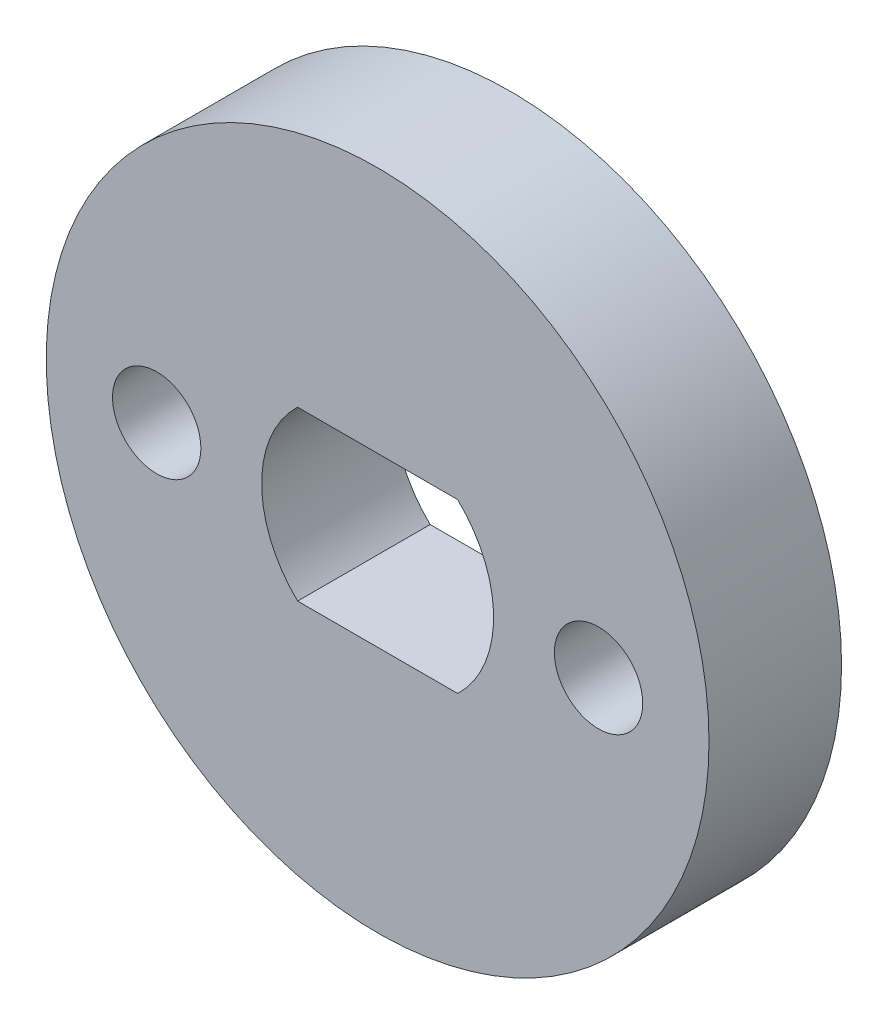
ISO-10303-21;
HEADER;
FILE_DESCRIPTION(('STEP AP214'),'2;1');
FILE_NAME('part.step','',(''),(''),'','','');
FILE_SCHEMA(('AUTOMOTIVE_DESIGN { 1 0 10303 214 1 1 1 1 }'));
ENDSEC;
DATA;
#1=APPLICATION_CONTEXT('core data for automotive mechanical design processes');
#2=APPLICATION_PROTOCOL_DEFINITION('international standard','automotive_design',2000,#1);
#3=PRODUCT_CONTEXT('',#1,'mechanical');
#4=PRODUCT('Part','Part','',(#3));
#5=PRODUCT_RELATED_PRODUCT_CATEGORY('part','',(#4));
#6=PRODUCT_DEFINITION_FORMATION('','',#4);
#7=PRODUCT_DEFINITION_CONTEXT('part definition',#1,'design');
#8=PRODUCT_DEFINITION('design','',#6,#7);
#9=PRODUCT_DEFINITION_SHAPE('','',#8);
#10=(LENGTH_UNIT() NAMED_UNIT(*) SI_UNIT(.MILLI.,.METRE.));
#11=(NAMED_UNIT(*) PLANE_ANGLE_UNIT() SI_UNIT($,.RADIAN.));
#12=(NAMED_UNIT(*) SI_UNIT($,.STERADIAN.) SOLID_ANGLE_UNIT());
#13=UNCERTAINTY_MEASURE_WITH_UNIT(LENGTH_MEASURE(1.E-05),#10,'distance_accuracy_value','');
#14=(GEOMETRIC_REPRESENTATION_CONTEXT(3) GLOBAL_UNCERTAINTY_ASSIGNED_CONTEXT((#13)) GLOBAL_UNIT_ASSIGNED_CONTEXT((#10,
#11,#12)) REPRESENTATION_CONTEXT('',''));
#15=CARTESIAN_POINT('',(0.,0.,0.));
#16=DIRECTION('',(0.,0.,1.));
#17=DIRECTION('',(1.,0.,0.));
#18=AXIS2_PLACEMENT_3D('',#15,#16,#17);
#19=CARTESIAN_POINT('',(0.,0.,3.));
#20=DIRECTION('',(0.,0.,1.));
#21=DIRECTION('',(1.,0.,0.));
#22=AXIS2_PLACEMENT_3D('',#19,#20,#21);
#23=PLANE('',#22);
#24=CARTESIAN_POINT('',(5.,0.,3.));
#25=DIRECTION('',(0.,0.,1.));
#26=DIRECTION('',(1.,0.,0.));
#27=AXIS2_PLACEMENT_3D('',#24,#25,#26);
#28=CIRCLE('',#27,0.999999999999998);
#29=CARTESIAN_POINT('',(6.,0.,3.));
#30=VERTEX_POINT('',#29);
#31=EDGE_CURVE('E155',#30,#30,#28,.T.);
#32=ORIENTED_EDGE('',*,*,#31,.F.);
#33=EDGE_LOOP('',(#32));
#34=FACE_BOUND('',#33,.T.);
#35=CARTESIAN_POINT('',(-5.,0.,3.));
#36=DIRECTION('',(0.,0.,1.));
#37=DIRECTION('',(1.,0.,0.));
#38=AXIS2_PLACEMENT_3D('',#35,#36,#37);
#39=CIRCLE('',#38,0.999999999999998);
#40=CARTESIAN_POINT('',(-4.,0.,3.));
#41=VERTEX_POINT('',#40);
#42=EDGE_CURVE('E102',#41,#41,#39,.T.);
#43=ORIENTED_EDGE('',*,*,#42,.F.);
#44=EDGE_LOOP('',(#43));
#45=FACE_BOUND('',#44,.T.);
#46=CARTESIAN_POINT('',(0.,0.,3.));
#47=DIRECTION('',(0.,0.,1.));
#48=DIRECTION('',(1.,0.,0.));
#49=AXIS2_PLACEMENT_3D('',#46,#47,#48);
#50=CIRCLE('',#49,7.5);
#51=CARTESIAN_POINT('',(7.5,0.,3.));
#52=VERTEX_POINT('',#51);
#53=EDGE_CURVE('E11',#52,#52,#50,.T.);
#54=ORIENTED_EDGE('',*,*,#53,.T.);
#55=EDGE_LOOP('',(#54));
#56=FACE_BOUND('',#55,.T.);
#57=CARTESIAN_POINT('',(0.,0.,3.));
#58=DIRECTION('',(0.,0.,-1.));
#59=DIRECTION('',(-1.,0.,0.));
#60=AXIS2_PLACEMENT_3D('',#57,#58,#59);
#61=CIRCLE('',#60,2.625);
#62=CARTESIAN_POINT('',(1.811249568668,1.9,3.));
#63=VERTEX_POINT('',#62);
#64=CARTESIAN_POINT('',(1.811249568668,-1.9,3.));
#65=VERTEX_POINT('',#64);
#66=EDGE_CURVE('E96',#63,#65,#61,.T.);
#67=ORIENTED_EDGE('',*,*,#66,.T.);
#68=DIRECTION('',(1.,0.,0.));
#69=VECTOR('',#68,1.);
#70=CARTESIAN_POINT('',(-1.811249568668,-1.9,3.));
#71=LINE('',#70,#69);
#72=CARTESIAN_POINT('',(-1.811249568668,-1.9,3.));
#73=VERTEX_POINT('',#72);
#74=EDGE_CURVE('E89',#73,#65,#71,.T.);
#75=ORIENTED_EDGE('',*,*,#74,.F.);
#76=CARTESIAN_POINT('',(0.,0.,3.));
#77=DIRECTION('',(0.,0.,1.));
#78=DIRECTION('',(1.,0.,0.));
#79=AXIS2_PLACEMENT_3D('',#76,#77,#78);
#80=CIRCLE('',#79,2.625);
#81=CARTESIAN_POINT('',(-1.811249568668,1.9,3.));
#82=VERTEX_POINT('',#81);
#83=EDGE_CURVE('E106',#82,#73,#80,.T.);
#84=ORIENTED_EDGE('',*,*,#83,.F.);
#85=DIRECTION('',(-1.,0.,0.));
#86=VECTOR('',#85,1.);
#87=CARTESIAN_POINT('',(-1.811249568668,1.9,3.));
#88=LINE('',#87,#86);
#89=EDGE_CURVE('E84',#63,#82,#88,.T.);
#90=ORIENTED_EDGE('',*,*,#89,.F.);
#91=EDGE_LOOP('',(#67,#75,#84,#90));
#92=FACE_BOUND('',#91,.T.);
#93=ADVANCED_FACE('F33',(#34,#45,#56,#92),#23,.T.);
#94=CARTESIAN_POINT('',(0.,0.,0.));
#95=DIRECTION('',(0.,0.,1.));
#96=DIRECTION('',(1.,0.,0.));
#97=AXIS2_PLACEMENT_3D('',#94,#95,#96);
#98=PLANE('',#97);
#99=CARTESIAN_POINT('',(5.,0.,0.));
#100=DIRECTION('',(0.,0.,1.));
#101=DIRECTION('',(1.,0.,0.));
#102=AXIS2_PLACEMENT_3D('',#99,#100,#101);
#103=CIRCLE('',#102,0.999999999999999);
#104=CARTESIAN_POINT('',(6.,0.,0.));
#105=VERTEX_POINT('',#104);
#106=EDGE_CURVE('E152',#105,#105,#103,.F.);
#107=ORIENTED_EDGE('',*,*,#106,.F.);
#108=EDGE_LOOP('',(#107));
#109=FACE_BOUND('',#108,.T.);
#110=CARTESIAN_POINT('',(-5.,0.,0.));
#111=DIRECTION('',(0.,0.,1.));
#112=DIRECTION('',(1.,0.,0.));
#113=AXIS2_PLACEMENT_3D('',#110,#111,#112);
#114=CIRCLE('',#113,0.999999999999999);
#115=CARTESIAN_POINT('',(-4.,0.,0.));
#116=VERTEX_POINT('',#115);
#117=EDGE_CURVE('E99',#116,#116,#114,.F.);
#118=ORIENTED_EDGE('',*,*,#117,.F.);
#119=EDGE_LOOP('',(#118));
#120=FACE_BOUND('',#119,.T.);
#121=CARTESIAN_POINT('',(0.,0.,0.));
#122=DIRECTION('',(0.,0.,1.));
#123=DIRECTION('',(1.,0.,0.));
#124=AXIS2_PLACEMENT_3D('',#121,#122,#123);
#125=CIRCLE('',#124,7.5);
#126=CARTESIAN_POINT('',(7.5,0.,0.));
#127=VERTEX_POINT('',#126);
#128=EDGE_CURVE('E37',#127,#127,#125,.T.);
#129=ORIENTED_EDGE('',*,*,#128,.F.);
#130=EDGE_LOOP('',(#129));
#131=FACE_BOUND('',#130,.T.);
#132=DIRECTION('',(1.,0.,0.));
#133=VECTOR('',#132,1.);
#134=CARTESIAN_POINT('',(-1.811249568668,-1.9,0.));
#135=LINE('',#134,#133);
#136=CARTESIAN_POINT('',(-1.811249568668,-1.9,0.));
#137=VERTEX_POINT('',#136);
#138=CARTESIAN_POINT('',(1.811249568668,-1.9,0.));
#139=VERTEX_POINT('',#138);
#140=EDGE_CURVE('E48',#137,#139,#135,.T.);
#141=ORIENTED_EDGE('',*,*,#140,.T.);
#142=CARTESIAN_POINT('',(0.,0.,0.));
#143=DIRECTION('',(0.,0.,-1.));
#144=DIRECTION('',(-1.,0.,0.));
#145=AXIS2_PLACEMENT_3D('',#142,#143,#144);
#146=CIRCLE('',#145,2.625);
#147=CARTESIAN_POINT('',(1.811249568668,1.9,0.));
#148=VERTEX_POINT('',#147);
#149=EDGE_CURVE('E81',#148,#139,#146,.T.);
#150=ORIENTED_EDGE('',*,*,#149,.F.);
#151=DIRECTION('',(-1.,0.,0.));
#152=VECTOR('',#151,1.);
#153=CARTESIAN_POINT('',(-1.811249568668,1.9,0.));
#154=LINE('',#153,#152);
#155=CARTESIAN_POINT('',(-1.811249568668,1.9,0.));
#156=VERTEX_POINT('',#155);
#157=EDGE_CURVE('E69',#148,#156,#154,.T.);
#158=ORIENTED_EDGE('',*,*,#157,.T.);
#159=CARTESIAN_POINT('',(0.,0.,0.));
#160=DIRECTION('',(0.,0.,1.));
#161=DIRECTION('',(1.,0.,0.));
#162=AXIS2_PLACEMENT_3D('',#159,#160,#161);
#163=CIRCLE('',#162,2.625);
#164=EDGE_CURVE('E83',#156,#137,#163,.T.);
#165=ORIENTED_EDGE('',*,*,#164,.T.);
#166=EDGE_LOOP('',(#141,#150,#158,#165));
#167=FACE_BOUND('',#166,.T.);
#168=ADVANCED_FACE('F79',(#109,#120,#131,#167),#98,.F.);
#169=CARTESIAN_POINT('',(0.,0.,3.));
#170=DIRECTION('',(0.,0.,-1.));
#171=DIRECTION('',(-1.,0.,0.));
#172=AXIS2_PLACEMENT_3D('',#169,#170,#171);
#173=CYLINDRICAL_SURFACE('',#172,7.5);
#174=ORIENTED_EDGE('',*,*,#53,.F.);
#175=EDGE_LOOP('',(#174));
#176=FACE_BOUND('',#175,.T.);
#177=ORIENTED_EDGE('',*,*,#128,.T.);
#178=EDGE_LOOP('',(#177));
#179=FACE_BOUND('',#178,.T.);
#180=ADVANCED_FACE('F35',(#176,#179),#173,.T.);
#181=CARTESIAN_POINT('',(0.,0.,0.));
#182=DIRECTION('',(0.,0.,1.));
#183=DIRECTION('',(1.,0.,0.));
#184=AXIS2_PLACEMENT_3D('',#181,#182,#183);
#185=CYLINDRICAL_SURFACE('',#184,2.625);
#186=ORIENTED_EDGE('',*,*,#83,.T.);
#187=DIRECTION('',(0.,0.,1.));
#188=VECTOR('',#187,1.);
#189=CARTESIAN_POINT('',(-1.811249568668,-1.9,0.));
#190=LINE('',#189,#188);
#191=EDGE_CURVE('E66',#137,#73,#190,.T.);
#192=ORIENTED_EDGE('',*,*,#191,.F.);
#193=ORIENTED_EDGE('',*,*,#164,.F.);
#194=DIRECTION('',(0.,0.,1.));
#195=VECTOR('',#194,1.);
#196=CARTESIAN_POINT('',(-1.811249568668,1.9,0.));
#197=LINE('',#196,#195);
#198=EDGE_CURVE('E57',#156,#82,#197,.T.);
#199=ORIENTED_EDGE('',*,*,#198,.T.);
#200=EDGE_LOOP('',(#186,#192,#193,#199));
#201=FACE_BOUND('',#200,.T.);
#202=ADVANCED_FACE('F125',(#201),#185,.F.);
#203=CARTESIAN_POINT('',(-1.811249568668,1.9,0.));
#204=DIRECTION('',(0.,1.,0.));
#205=DIRECTION('',(0.,0.,1.));
#206=AXIS2_PLACEMENT_3D('',#203,#204,#205);
#207=PLANE('',#206);
#208=ORIENTED_EDGE('',*,*,#89,.T.);
#209=ORIENTED_EDGE('',*,*,#198,.F.);
#210=ORIENTED_EDGE('',*,*,#157,.F.);
#211=DIRECTION('',(0.,0.,1.));
#212=VECTOR('',#211,1.);
#213=CARTESIAN_POINT('',(1.811249568668,1.9,0.));
#214=LINE('',#213,#212);
#215=EDGE_CURVE('E93',#148,#63,#214,.T.);
#216=ORIENTED_EDGE('',*,*,#215,.T.);
#217=EDGE_LOOP('',(#208,#209,#210,#216));
#218=FACE_BOUND('',#217,.T.);
#219=ADVANCED_FACE('F134',(#218),#207,.F.);
#220=CARTESIAN_POINT('',(-1.811249568668,-1.9,0.));
#221=DIRECTION('',(0.,-1.,0.));
#222=DIRECTION('',(0.,0.,-1.));
#223=AXIS2_PLACEMENT_3D('',#220,#221,#222);
#224=PLANE('',#223);
#225=ORIENTED_EDGE('',*,*,#74,.T.);
#226=DIRECTION('',(0.,0.,1.));
#227=VECTOR('',#226,1.);
#228=CARTESIAN_POINT('',(1.811249568668,-1.9,0.));
#229=LINE('',#228,#227);
#230=EDGE_CURVE('E87',#139,#65,#229,.T.);
#231=ORIENTED_EDGE('',*,*,#230,.F.);
#232=ORIENTED_EDGE('',*,*,#140,.F.);
#233=ORIENTED_EDGE('',*,*,#191,.T.);
#234=EDGE_LOOP('',(#225,#231,#232,#233));
#235=FACE_BOUND('',#234,.T.);
#236=ADVANCED_FACE('F88',(#235),#224,.F.);
#237=CARTESIAN_POINT('',(0.,0.,0.));
#238=DIRECTION('',(0.,0.,1.));
#239=DIRECTION('',(1.,0.,0.));
#240=AXIS2_PLACEMENT_3D('',#237,#238,#239);
#241=CYLINDRICAL_SURFACE('',#240,2.625);
#242=ORIENTED_EDGE('',*,*,#66,.F.);
#243=ORIENTED_EDGE('',*,*,#215,.F.);
#244=ORIENTED_EDGE('',*,*,#149,.T.);
#245=ORIENTED_EDGE('',*,*,#230,.T.);
#246=EDGE_LOOP('',(#242,#243,#244,#245));
#247=FACE_BOUND('',#246,.T.);
#248=ADVANCED_FACE('F95',(#247),#241,.F.);
#249=CARTESIAN_POINT('',(-5.,0.,3.));
#250=DIRECTION('',(0.,0.,1.));
#251=DIRECTION('',(1.,0.,0.));
#252=AXIS2_PLACEMENT_3D('',#249,#250,#251);
#253=CYLINDRICAL_SURFACE('',#252,0.999999999999999);
#254=ORIENTED_EDGE('',*,*,#117,.T.);
#255=EDGE_LOOP('',(#254));
#256=FACE_BOUND('',#255,.T.);
#257=ORIENTED_EDGE('',*,*,#42,.T.);
#258=EDGE_LOOP('',(#257));
#259=FACE_BOUND('',#258,.T.);
#260=ADVANCED_FACE('F141',(#256,#259),#253,.F.);
#261=CARTESIAN_POINT('',(5.,0.,3.));
#262=DIRECTION('',(0.,0.,1.));
#263=DIRECTION('',(1.,0.,0.));
#264=AXIS2_PLACEMENT_3D('',#261,#262,#263);
#265=CYLINDRICAL_SURFACE('',#264,0.999999999999999);
#266=ORIENTED_EDGE('',*,*,#106,.T.);
#267=EDGE_LOOP('',(#266));
#268=FACE_BOUND('',#267,.T.);
#269=ORIENTED_EDGE('',*,*,#31,.T.);
#270=EDGE_LOOP('',(#269));
#271=FACE_BOUND('',#270,.T.);
#272=ADVANCED_FACE('F144',(#268,#271),#265,.F.);
#273=CLOSED_SHELL('',(#93,#168,#180,#202,#219,#236,#248,#260,#272));
#274=MANIFOLD_SOLID_BREP('B2',#273);
#275=ADVANCED_BREP_SHAPE_REPRESENTATION('',(#18,#274),#14);
#276=SHAPE_DEFINITION_REPRESENTATION(#9,#275);
ENDSEC;
END-ISO-10303-21;
